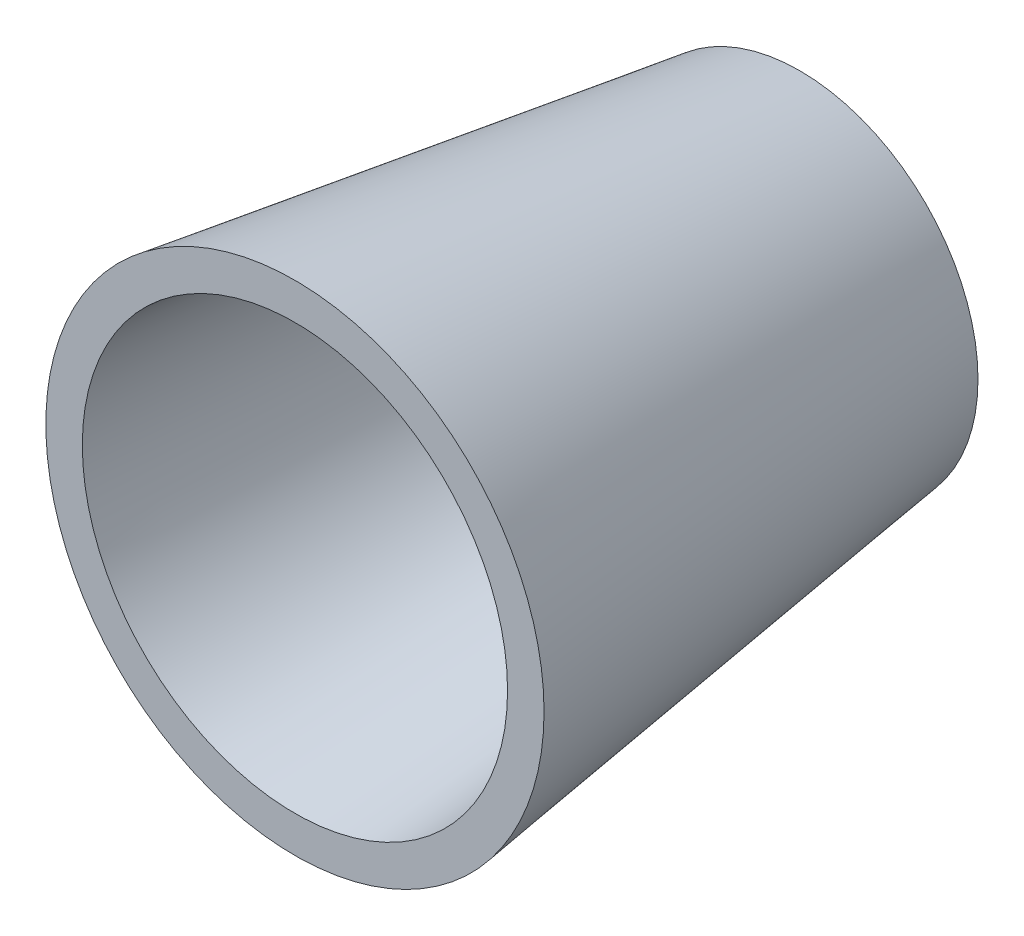
ISO-10303-21;
HEADER;
FILE_DESCRIPTION(('STEP AP214'),'2;1');
FILE_NAME('part.step','',(''),(''),'','','');
FILE_SCHEMA(('AUTOMOTIVE_DESIGN { 1 0 10303 214 1 1 1 1 }'));
ENDSEC;
DATA;
#1=APPLICATION_CONTEXT('core data for automotive mechanical design processes');
#2=APPLICATION_PROTOCOL_DEFINITION('international standard','automotive_design',2000,#1);
#3=PRODUCT_CONTEXT('',#1,'mechanical');
#4=PRODUCT('Part','Part','',(#3));
#5=PRODUCT_RELATED_PRODUCT_CATEGORY('part','',(#4));
#6=PRODUCT_DEFINITION_FORMATION('','',#4);
#7=PRODUCT_DEFINITION_CONTEXT('part definition',#1,'design');
#8=PRODUCT_DEFINITION('design','',#6,#7);
#9=PRODUCT_DEFINITION_SHAPE('','',#8);
#10=(LENGTH_UNIT() NAMED_UNIT(*) SI_UNIT(.MILLI.,.METRE.));
#11=(NAMED_UNIT(*) PLANE_ANGLE_UNIT() SI_UNIT($,.RADIAN.));
#12=(NAMED_UNIT(*) SI_UNIT($,.STERADIAN.) SOLID_ANGLE_UNIT());
#13=UNCERTAINTY_MEASURE_WITH_UNIT(LENGTH_MEASURE(1.E-05),#10,'distance_accuracy_value','');
#14=(GEOMETRIC_REPRESENTATION_CONTEXT(3) GLOBAL_UNCERTAINTY_ASSIGNED_CONTEXT((#13)) GLOBAL_UNIT_ASSIGNED_CONTEXT((#10,
#11,#12)) REPRESENTATION_CONTEXT('',''));
#15=CARTESIAN_POINT('',(0.,0.,0.));
#16=DIRECTION('',(0.,0.,1.));
#17=DIRECTION('',(1.,0.,0.));
#18=AXIS2_PLACEMENT_3D('',#15,#16,#17);
#19=CARTESIAN_POINT('',(0.,0.,130.));
#20=DIRECTION('',(0.,0.,-1.));
#21=DIRECTION('',(-1.,0.,0.));
#22=AXIS2_PLACEMENT_3D('',#19,#20,#21);
#23=CYLINDRICAL_SURFACE('',#22,36.8491191727633);
#24=CARTESIAN_POINT('',(0.,0.,0.));
#25=DIRECTION('',(0.,0.,-1.));
#26=DIRECTION('',(-1.,0.,0.));
#27=AXIS2_PLACEMENT_3D('',#24,#25,#26);
#28=CIRCLE('',#27,36.8491191727633);
#29=CARTESIAN_POINT('',(-36.8491191727633,0.,0.));
#30=VERTEX_POINT('',#29);
#31=EDGE_CURVE('E51',#30,#30,#28,.T.);
#32=ORIENTED_EDGE('',*,*,#31,.T.);
#33=EDGE_LOOP('',(#32));
#34=FACE_BOUND('',#33,.T.);
#35=CARTESIAN_POINT('',(0.,0.,9.00000000000001));
#36=DIRECTION('',(0.,0.,1.));
#37=DIRECTION('',(1.,0.,0.));
#38=AXIS2_PLACEMENT_3D('',#35,#36,#37);
#39=CIRCLE('',#38,36.8491191727633);
#40=CARTESIAN_POINT('',(36.8491191727633,0.,9.00000000000001));
#41=VERTEX_POINT('',#40);
#42=EDGE_CURVE('E41',#41,#41,#39,.F.);
#43=ORIENTED_EDGE('',*,*,#42,.F.);
#44=EDGE_LOOP('',(#43));
#45=FACE_BOUND('',#44,.T.);
#46=ADVANCED_FACE('F37',(#34,#45),#23,.F.);
#47=CARTESIAN_POINT('',(0.,0.,0.));
#48=DIRECTION('',(0.,0.,1.));
#49=DIRECTION('',(1.,0.,0.));
#50=AXIS2_PLACEMENT_3D('',#47,#48,#49);
#51=CONICAL_SURFACE('',#50,52.9278620154114,0.139626340159546);
#52=CARTESIAN_POINT('',(0.,0.,150.));
#53=DIRECTION('',(0.,0.,1.));
#54=DIRECTION('',(1.,0.,0.));
#55=AXIS2_PLACEMENT_3D('',#52,#53,#54);
#56=CIRCLE('',#55,74.0089872207701);
#57=CARTESIAN_POINT('',(74.0089872207701,0.,150.));
#58=VERTEX_POINT('',#57);
#59=EDGE_CURVE('E10',#58,#58,#56,.T.);
#60=ORIENTED_EDGE('',*,*,#59,.F.);
#61=EDGE_LOOP('',(#60));
#62=FACE_BOUND('',#61,.T.);
#63=CARTESIAN_POINT('',(0.,0.,0.));
#64=DIRECTION('',(0.,0.,1.));
#65=DIRECTION('',(1.,0.,0.));
#66=AXIS2_PLACEMENT_3D('',#63,#64,#65);
#67=CIRCLE('',#66,52.9278620154114);
#68=CARTESIAN_POINT('',(52.9278620154114,0.,0.));
#69=VERTEX_POINT('',#68);
#70=EDGE_CURVE('E46',#69,#69,#67,.T.);
#71=ORIENTED_EDGE('',*,*,#70,.T.);
#72=EDGE_LOOP('',(#71));
#73=FACE_BOUND('',#72,.T.);
#74=ADVANCED_FACE('F39',(#62,#73),#51,.T.);
#75=CARTESIAN_POINT('',(0.,0.,150.));
#76=DIRECTION('',(0.,0.,1.));
#77=DIRECTION('',(1.,0.,0.));
#78=AXIS2_PLACEMENT_3D('',#75,#76,#77);
#79=PLANE('',#78);
#80=CARTESIAN_POINT('',(0.,0.,150.));
#81=DIRECTION('',(0.,0.,1.));
#82=DIRECTION('',(1.,0.,0.));
#83=AXIS2_PLACEMENT_3D('',#80,#81,#82);
#84=CIRCLE('',#83,63.1687409431443);
#85=CARTESIAN_POINT('',(63.1687409431443,0.,150.));
#86=VERTEX_POINT('',#85);
#87=EDGE_CURVE('E61',#86,#86,#84,.T.);
#88=ORIENTED_EDGE('',*,*,#87,.F.);
#89=EDGE_LOOP('',(#88));
#90=FACE_BOUND('',#89,.T.);
#91=ORIENTED_EDGE('',*,*,#59,.T.);
#92=EDGE_LOOP('',(#91));
#93=FACE_BOUND('',#92,.T.);
#94=ADVANCED_FACE('F68',(#90,#93),#79,.T.);
#95=CARTESIAN_POINT('',(0.,0.,0.));
#96=DIRECTION('',(0.,0.,1.));
#97=DIRECTION('',(1.,0.,0.));
#98=AXIS2_PLACEMENT_3D('',#95,#96,#97);
#99=PLANE('',#98);
#100=ORIENTED_EDGE('',*,*,#31,.F.);
#101=EDGE_LOOP('',(#100));
#102=FACE_BOUND('',#101,.T.);
#103=ORIENTED_EDGE('',*,*,#70,.F.);
#104=EDGE_LOOP('',(#103));
#105=FACE_BOUND('',#104,.T.);
#106=ADVANCED_FACE('F70',(#102,#105),#99,.F.);
#107=CARTESIAN_POINT('',(0.,0.,9.00000000000001));
#108=DIRECTION('',(0.,0.,1.));
#109=DIRECTION('',(1.,0.,0.));
#110=AXIS2_PLACEMENT_3D('',#107,#108,#109);
#111=PLANE('',#110);
#112=CARTESIAN_POINT('',(0.,0.,9.00000000000001));
#113=DIRECTION('',(0.,0.,1.));
#114=DIRECTION('',(1.,0.,0.));
#115=AXIS2_PLACEMENT_3D('',#112,#113,#114);
#116=CIRCLE('',#115,50.832839385989);
#117=CARTESIAN_POINT('',(50.832839385989,0.,9.00000000000001));
#118=VERTEX_POINT('',#117);
#119=EDGE_CURVE('E57',#118,#118,#116,.T.);
#120=ORIENTED_EDGE('',*,*,#119,.T.);
#121=EDGE_LOOP('',(#120));
#122=FACE_BOUND('',#121,.T.);
#123=ORIENTED_EDGE('',*,*,#42,.T.);
#124=EDGE_LOOP('',(#123));
#125=FACE_BOUND('',#124,.T.);
#126=ADVANCED_FACE('F76',(#122,#125),#111,.T.);
#127=CARTESIAN_POINT('',(0.,0.,150.));
#128=DIRECTION('',(0.,0.,1.));
#129=DIRECTION('',(1.,0.,0.));
#130=AXIS2_PLACEMENT_3D('',#127,#128,#129);
#131=CONICAL_SURFACE('',#130,63.1687409431443,0.0872664625997165);
#132=ORIENTED_EDGE('',*,*,#119,.F.);
#133=EDGE_LOOP('',(#132));
#134=FACE_BOUND('',#133,.T.);
#135=ORIENTED_EDGE('',*,*,#87,.T.);
#136=EDGE_LOOP('',(#135));
#137=FACE_BOUND('',#136,.T.);
#138=ADVANCED_FACE('F66',(#134,#137),#131,.F.);
#139=CLOSED_SHELL('',(#46,#74,#94,#106,#126,#138));
#140=MANIFOLD_SOLID_BREP('B2',#139);
#141=ADVANCED_BREP_SHAPE_REPRESENTATION('',(#18,#140),#14);
#142=SHAPE_DEFINITION_REPRESENTATION(#9,#141);
ENDSEC;
END-ISO-10303-21;
